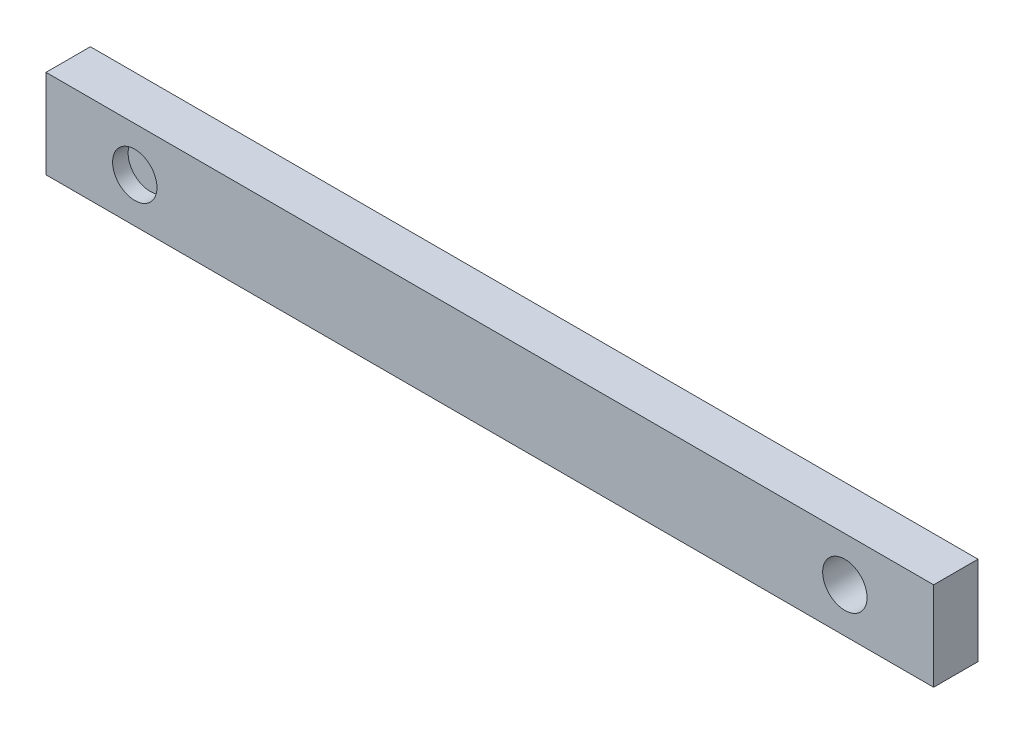
ISO-10303-21;
HEADER;
FILE_DESCRIPTION(('STEP AP214'),'2;1');
FILE_NAME('part.step','',(''),(''),'','','');
FILE_SCHEMA(('AUTOMOTIVE_DESIGN { 1 0 10303 214 1 1 1 1 }'));
ENDSEC;
DATA;
#1=APPLICATION_CONTEXT('core data for automotive mechanical design processes');
#2=APPLICATION_PROTOCOL_DEFINITION('international standard','automotive_design',2000,#1);
#3=PRODUCT_CONTEXT('',#1,'mechanical');
#4=PRODUCT('Part','Part','',(#3));
#5=PRODUCT_RELATED_PRODUCT_CATEGORY('part','',(#4));
#6=PRODUCT_DEFINITION_FORMATION('','',#4);
#7=PRODUCT_DEFINITION_CONTEXT('part definition',#1,'design');
#8=PRODUCT_DEFINITION('design','',#6,#7);
#9=PRODUCT_DEFINITION_SHAPE('','',#8);
#10=(LENGTH_UNIT() NAMED_UNIT(*) SI_UNIT(.MILLI.,.METRE.));
#11=(NAMED_UNIT(*) PLANE_ANGLE_UNIT() SI_UNIT($,.RADIAN.));
#12=(NAMED_UNIT(*) SI_UNIT($,.STERADIAN.) SOLID_ANGLE_UNIT());
#13=UNCERTAINTY_MEASURE_WITH_UNIT(LENGTH_MEASURE(1.E-05),#10,'distance_accuracy_value','');
#14=(GEOMETRIC_REPRESENTATION_CONTEXT(3) GLOBAL_UNCERTAINTY_ASSIGNED_CONTEXT((#13)) GLOBAL_UNIT_ASSIGNED_CONTEXT((#10,
#11,#12)) REPRESENTATION_CONTEXT('',''));
#15=CARTESIAN_POINT('',(0.,0.,0.));
#16=DIRECTION('',(0.,0.,1.));
#17=DIRECTION('',(1.,0.,0.));
#18=AXIS2_PLACEMENT_3D('',#15,#16,#17);
#19=CARTESIAN_POINT('',(0.,0.,10.));
#20=DIRECTION('',(0.,0.,-1.));
#21=DIRECTION('',(-1.,0.,0.));
#22=AXIS2_PLACEMENT_3D('',#19,#20,#21);
#23=PLANE('',#22);
#24=CARTESIAN_POINT('',(-77.835698790639,0.,10.));
#25=DIRECTION('',(0.,0.,1.));
#26=DIRECTION('',(1.,0.,0.));
#27=AXIS2_PLACEMENT_3D('',#24,#25,#26);
#28=CIRCLE('',#27,5.);
#29=CARTESIAN_POINT('',(-72.835698790639,0.,10.));
#30=VERTEX_POINT('',#29);
#31=EDGE_CURVE('E117',#30,#30,#28,.T.);
#32=ORIENTED_EDGE('',*,*,#31,.F.);
#33=EDGE_LOOP('',(#32));
#34=FACE_BOUND('',#33,.T.);
#35=DIRECTION('',(0.,1.,0.));
#36=VECTOR('',#35,1.);
#37=CARTESIAN_POINT('',(102.164301209361,-10.,10.));
#38=LINE('',#37,#36);
#39=CARTESIAN_POINT('',(102.164301209361,-10.,10.));
#40=VERTEX_POINT('',#39);
#41=CARTESIAN_POINT('',(102.164301209361,10.,10.));
#42=VERTEX_POINT('',#41);
#43=EDGE_CURVE('E84',#40,#42,#38,.T.);
#44=ORIENTED_EDGE('',*,*,#43,.T.);
#45=DIRECTION('',(-1.,0.,0.));
#46=VECTOR('',#45,1.);
#47=CARTESIAN_POINT('',(-97.835698790639,10.,10.));
#48=LINE('',#47,#46);
#49=CARTESIAN_POINT('',(-97.835698790639,10.,10.));
#50=VERTEX_POINT('',#49);
#51=EDGE_CURVE('E79',#42,#50,#48,.T.);
#52=ORIENTED_EDGE('',*,*,#51,.T.);
#53=DIRECTION('',(0.,-1.,0.));
#54=VECTOR('',#53,1.);
#55=CARTESIAN_POINT('',(-97.835698790639,-10.,10.));
#56=LINE('',#55,#54);
#57=CARTESIAN_POINT('',(-97.835698790639,-10.,10.));
#58=VERTEX_POINT('',#57);
#59=EDGE_CURVE('E82',#50,#58,#56,.T.);
#60=ORIENTED_EDGE('',*,*,#59,.T.);
#61=DIRECTION('',(1.,0.,0.));
#62=VECTOR('',#61,1.);
#63=CARTESIAN_POINT('',(-97.835698790639,-10.,10.));
#64=LINE('',#63,#62);
#65=EDGE_CURVE('E49',#58,#40,#64,.T.);
#66=ORIENTED_EDGE('',*,*,#65,.T.);
#67=EDGE_LOOP('',(#44,#52,#60,#66));
#68=FACE_BOUND('',#67,.T.);
#69=CARTESIAN_POINT('',(82.164301209361,0.,10.));
#70=DIRECTION('',(0.,0.,1.));
#71=DIRECTION('',(1.,0.,0.));
#72=AXIS2_PLACEMENT_3D('',#69,#70,#71);
#73=CIRCLE('',#72,5.);
#74=CARTESIAN_POINT('',(87.164301209361,0.,10.));
#75=VERTEX_POINT('',#74);
#76=EDGE_CURVE('E99',#75,#75,#73,.T.);
#77=ORIENTED_EDGE('',*,*,#76,.F.);
#78=EDGE_LOOP('',(#77));
#79=FACE_BOUND('',#78,.T.);
#80=ADVANCED_FACE('F32',(#34,#68,#79),#23,.F.);
#81=CARTESIAN_POINT('',(0.,0.,0.));
#82=DIRECTION('',(0.,0.,-1.));
#83=DIRECTION('',(-1.,0.,0.));
#84=AXIS2_PLACEMENT_3D('',#81,#82,#83);
#85=PLANE('',#84);
#86=DIRECTION('',(0.,1.,0.));
#87=VECTOR('',#86,1.);
#88=CARTESIAN_POINT('',(102.164301209361,-10.,0.));
#89=LINE('',#88,#87);
#90=CARTESIAN_POINT('',(102.164301209361,-10.,0.));
#91=VERTEX_POINT('',#90);
#92=CARTESIAN_POINT('',(102.164301209361,10.,0.));
#93=VERTEX_POINT('',#92);
#94=EDGE_CURVE('E96',#91,#93,#89,.T.);
#95=ORIENTED_EDGE('',*,*,#94,.F.);
#96=DIRECTION('',(1.,0.,0.));
#97=VECTOR('',#96,1.);
#98=CARTESIAN_POINT('',(-97.835698790639,-10.,0.));
#99=LINE('',#98,#97);
#100=CARTESIAN_POINT('',(-97.835698790639,-10.,0.));
#101=VERTEX_POINT('',#100);
#102=EDGE_CURVE('E72',#101,#91,#99,.T.);
#103=ORIENTED_EDGE('',*,*,#102,.F.);
#104=DIRECTION('',(0.,-1.,0.));
#105=VECTOR('',#104,1.);
#106=CARTESIAN_POINT('',(-97.835698790639,-10.,0.));
#107=LINE('',#106,#105);
#108=CARTESIAN_POINT('',(-97.835698790639,10.,0.));
#109=VERTEX_POINT('',#108);
#110=EDGE_CURVE('E66',#109,#101,#107,.T.);
#111=ORIENTED_EDGE('',*,*,#110,.F.);
#112=DIRECTION('',(-1.,0.,0.));
#113=VECTOR('',#112,1.);
#114=CARTESIAN_POINT('',(-97.835698790639,10.,0.));
#115=LINE('',#114,#113);
#116=EDGE_CURVE('E88',#93,#109,#115,.T.);
#117=ORIENTED_EDGE('',*,*,#116,.F.);
#118=EDGE_LOOP('',(#95,#103,#111,#117));
#119=FACE_BOUND('',#118,.T.);
#120=CARTESIAN_POINT('',(82.164301209361,0.,0.));
#121=DIRECTION('',(0.,0.,1.));
#122=DIRECTION('',(1.,0.,0.));
#123=AXIS2_PLACEMENT_3D('',#120,#121,#122);
#124=CIRCLE('',#123,5.);
#125=CARTESIAN_POINT('',(87.164301209361,0.,0.));
#126=VERTEX_POINT('',#125);
#127=EDGE_CURVE('E111',#126,#126,#124,.T.);
#128=ORIENTED_EDGE('',*,*,#127,.T.);
#129=EDGE_LOOP('',(#128));
#130=FACE_BOUND('',#129,.T.);
#131=ADVANCED_FACE('F107',(#119,#130),#85,.T.);
#132=CARTESIAN_POINT('',(102.164301209361,-10.,10.));
#133=DIRECTION('',(-1.,0.,0.));
#134=DIRECTION('',(0.,0.,1.));
#135=AXIS2_PLACEMENT_3D('',#132,#133,#134);
#136=PLANE('',#135);
#137=ORIENTED_EDGE('',*,*,#94,.T.);
#138=DIRECTION('',(0.,0.,-1.));
#139=VECTOR('',#138,1.);
#140=CARTESIAN_POINT('',(102.164301209361,10.,10.));
#141=LINE('',#140,#139);
#142=EDGE_CURVE('E11',#42,#93,#141,.T.);
#143=ORIENTED_EDGE('',*,*,#142,.F.);
#144=ORIENTED_EDGE('',*,*,#43,.F.);
#145=DIRECTION('',(0.,0.,-1.));
#146=VECTOR('',#145,1.);
#147=CARTESIAN_POINT('',(102.164301209361,-10.,10.));
#148=LINE('',#147,#146);
#149=EDGE_CURVE('E92',#40,#91,#148,.T.);
#150=ORIENTED_EDGE('',*,*,#149,.T.);
#151=EDGE_LOOP('',(#137,#143,#144,#150));
#152=FACE_BOUND('',#151,.T.);
#153=ADVANCED_FACE('F34',(#152),#136,.F.);
#154=CARTESIAN_POINT('',(-97.835698790639,10.,10.));
#155=DIRECTION('',(0.,-1.,0.));
#156=DIRECTION('',(0.,0.,-1.));
#157=AXIS2_PLACEMENT_3D('',#154,#155,#156);
#158=PLANE('',#157);
#159=ORIENTED_EDGE('',*,*,#116,.T.);
#160=DIRECTION('',(0.,0.,-1.));
#161=VECTOR('',#160,1.);
#162=CARTESIAN_POINT('',(-97.835698790639,10.,10.));
#163=LINE('',#162,#161);
#164=EDGE_CURVE('E41',#50,#109,#163,.T.);
#165=ORIENTED_EDGE('',*,*,#164,.F.);
#166=ORIENTED_EDGE('',*,*,#51,.F.);
#167=ORIENTED_EDGE('',*,*,#142,.T.);
#168=EDGE_LOOP('',(#159,#165,#166,#167));
#169=FACE_BOUND('',#168,.T.);
#170=ADVANCED_FACE('F87',(#169),#158,.F.);
#171=CARTESIAN_POINT('',(-97.835698790639,-10.,10.));
#172=DIRECTION('',(1.,0.,0.));
#173=DIRECTION('',(0.,0.,-1.));
#174=AXIS2_PLACEMENT_3D('',#171,#172,#173);
#175=PLANE('',#174);
#176=ORIENTED_EDGE('',*,*,#110,.T.);
#177=DIRECTION('',(0.,0.,-1.));
#178=VECTOR('',#177,1.);
#179=CARTESIAN_POINT('',(-97.835698790639,-10.,10.));
#180=LINE('',#179,#178);
#181=EDGE_CURVE('E89',#58,#101,#180,.T.);
#182=ORIENTED_EDGE('',*,*,#181,.F.);
#183=ORIENTED_EDGE('',*,*,#59,.F.);
#184=ORIENTED_EDGE('',*,*,#164,.T.);
#185=EDGE_LOOP('',(#176,#182,#183,#184));
#186=FACE_BOUND('',#185,.T.);
#187=ADVANCED_FACE('F90',(#186),#175,.F.);
#188=CARTESIAN_POINT('',(-97.835698790639,-10.,10.));
#189=DIRECTION('',(0.,1.,0.));
#190=DIRECTION('',(0.,0.,1.));
#191=AXIS2_PLACEMENT_3D('',#188,#189,#190);
#192=PLANE('',#191);
#193=ORIENTED_EDGE('',*,*,#102,.T.);
#194=ORIENTED_EDGE('',*,*,#149,.F.);
#195=ORIENTED_EDGE('',*,*,#65,.F.);
#196=ORIENTED_EDGE('',*,*,#181,.T.);
#197=EDGE_LOOP('',(#193,#194,#195,#196));
#198=FACE_BOUND('',#197,.T.);
#199=ADVANCED_FACE('F104',(#198),#192,.F.);
#200=CARTESIAN_POINT('',(82.164301209361,0.,10.));
#201=DIRECTION('',(0.,0.,-1.));
#202=DIRECTION('',(-1.,0.,0.));
#203=AXIS2_PLACEMENT_3D('',#200,#201,#202);
#204=CYLINDRICAL_SURFACE('',#203,5.);
#205=ORIENTED_EDGE('',*,*,#76,.T.);
#206=EDGE_LOOP('',(#205));
#207=FACE_BOUND('',#206,.T.);
#208=ORIENTED_EDGE('',*,*,#127,.F.);
#209=EDGE_LOOP('',(#208));
#210=FACE_BOUND('',#209,.T.);
#211=ADVANCED_FACE('F128',(#207,#210),#204,.F.);
#212=CARTESIAN_POINT('',(-77.835698790639,0.,6.5));
#213=DIRECTION('',(0.,0.,1.));
#214=DIRECTION('',(1.,0.,0.));
#215=AXIS2_PLACEMENT_3D('',#212,#213,#214);
#216=CYLINDRICAL_SURFACE('',#215,5.);
#217=CARTESIAN_POINT('',(-77.835698790639,0.,6.5));
#218=DIRECTION('',(0.,0.,1.));
#219=DIRECTION('',(1.,0.,0.));
#220=AXIS2_PLACEMENT_3D('',#217,#218,#219);
#221=CIRCLE('',#220,5.);
#222=CARTESIAN_POINT('',(-72.835698790639,0.,6.5));
#223=VERTEX_POINT('',#222);
#224=EDGE_CURVE('E114',#223,#223,#221,.T.);
#225=ORIENTED_EDGE('',*,*,#224,.F.);
#226=EDGE_LOOP('',(#225));
#227=FACE_BOUND('',#226,.T.);
#228=ORIENTED_EDGE('',*,*,#31,.T.);
#229=EDGE_LOOP('',(#228));
#230=FACE_BOUND('',#229,.T.);
#231=ADVANCED_FACE('F125',(#227,#230),#216,.F.);
#232=CARTESIAN_POINT('',(-77.835698790639,0.,6.5));
#233=DIRECTION('',(0.,0.,1.));
#234=DIRECTION('',(1.,0.,0.));
#235=AXIS2_PLACEMENT_3D('',#232,#233,#234);
#236=PLANE('',#235);
#237=ORIENTED_EDGE('',*,*,#224,.T.);
#238=EDGE_LOOP('',(#237));
#239=FACE_BOUND('',#238,.T.);
#240=ADVANCED_FACE('F123',(#239),#236,.T.);
#241=CLOSED_SHELL('',(#80,#131,#153,#170,#187,#199,#211,#231,#240));
#242=MANIFOLD_SOLID_BREP('B2',#241);
#243=ADVANCED_BREP_SHAPE_REPRESENTATION('',(#18,#242),#14);
#244=SHAPE_DEFINITION_REPRESENTATION(#9,#243);
ENDSEC;
END-ISO-10303-21;
